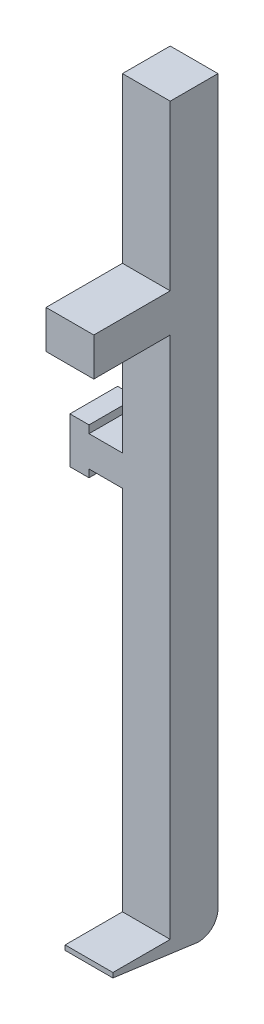
ISO-10303-21;
HEADER;
FILE_DESCRIPTION(('STEP AP214'),'2;1');
FILE_NAME('part.step','',(''),(''),'','','');
FILE_SCHEMA(('AUTOMOTIVE_DESIGN { 1 0 10303 214 1 1 1 1 }'));
ENDSEC;
DATA;
#1=APPLICATION_CONTEXT('core data for automotive mechanical design processes');
#2=APPLICATION_PROTOCOL_DEFINITION('international standard','automotive_design',2000,#1);
#3=PRODUCT_CONTEXT('',#1,'mechanical');
#4=PRODUCT('Part','Part','',(#3));
#5=PRODUCT_RELATED_PRODUCT_CATEGORY('part','',(#4));
#6=PRODUCT_DEFINITION_FORMATION('','',#4);
#7=PRODUCT_DEFINITION_CONTEXT('part definition',#1,'design');
#8=PRODUCT_DEFINITION('design','',#6,#7);
#9=PRODUCT_DEFINITION_SHAPE('','',#8);
#10=(LENGTH_UNIT() NAMED_UNIT(*) SI_UNIT(.MILLI.,.METRE.));
#11=(NAMED_UNIT(*) PLANE_ANGLE_UNIT() SI_UNIT($,.RADIAN.));
#12=(NAMED_UNIT(*) SI_UNIT($,.STERADIAN.) SOLID_ANGLE_UNIT());
#13=UNCERTAINTY_MEASURE_WITH_UNIT(LENGTH_MEASURE(1.E-05),#10,'distance_accuracy_value','');
#14=(GEOMETRIC_REPRESENTATION_CONTEXT(3) GLOBAL_UNCERTAINTY_ASSIGNED_CONTEXT((#13)) GLOBAL_UNIT_ASSIGNED_CONTEXT((#10,
#11,#12)) REPRESENTATION_CONTEXT('',''));
#15=CARTESIAN_POINT('',(0.,0.,0.));
#16=DIRECTION('',(0.,0.,1.));
#17=DIRECTION('',(1.,0.,0.));
#18=AXIS2_PLACEMENT_3D('',#15,#16,#17);
#19=CARTESIAN_POINT('',(-1.25,38.,1.25));
#20=DIRECTION('',(0.,0.,-1.));
#21=DIRECTION('',(-1.,0.,0.));
#22=AXIS2_PLACEMENT_3D('',#19,#20,#21);
#23=PLANE('',#22);
#24=DIRECTION('',(1.,0.,0.));
#25=VECTOR('',#24,1.);
#26=CARTESIAN_POINT('',(-1.25,28.4,1.25));
#27=LINE('',#26,#25);
#28=CARTESIAN_POINT('',(-1.25,28.4,1.25));
#29=VERTEX_POINT('',#28);
#30=CARTESIAN_POINT('',(1.25,28.4,1.25));
#31=VERTEX_POINT('',#30);
#32=EDGE_CURVE('E392',#29,#31,#27,.T.);
#33=ORIENTED_EDGE('',*,*,#32,.F.);
#34=DIRECTION('',(0.,-1.,0.));
#35=VECTOR('',#34,1.);
#36=CARTESIAN_POINT('',(-1.25,38.,1.25));
#37=LINE('',#36,#35);
#38=CARTESIAN_POINT('',(-1.25,21.8,1.25));
#39=VERTEX_POINT('',#38);
#40=EDGE_CURVE('E202',#29,#39,#37,.T.);
#41=ORIENTED_EDGE('',*,*,#40,.T.);
#42=DIRECTION('',(-1.,0.,0.));
#43=VECTOR('',#42,1.);
#44=CARTESIAN_POINT('',(-1.25,21.8,1.25));
#45=LINE('',#44,#43);
#46=CARTESIAN_POINT('',(-3.,21.8,1.25));
#47=VERTEX_POINT('',#46);
#48=EDGE_CURVE('E232',#39,#47,#45,.T.);
#49=ORIENTED_EDGE('',*,*,#48,.T.);
#50=DIRECTION('',(0.,1.,0.));
#51=VECTOR('',#50,1.);
#52=CARTESIAN_POINT('',(-3.,21.8,1.25));
#53=LINE('',#52,#51);
#54=CARTESIAN_POINT('',(-3.,22.2,1.25));
#55=VERTEX_POINT('',#54);
#56=EDGE_CURVE('E226',#47,#55,#53,.T.);
#57=ORIENTED_EDGE('',*,*,#56,.T.);
#58=DIRECTION('',(-1.,0.,0.));
#59=VECTOR('',#58,1.);
#60=CARTESIAN_POINT('',(-3.,22.2,1.25));
#61=LINE('',#60,#59);
#62=CARTESIAN_POINT('',(-4.,22.2,1.25));
#63=VERTEX_POINT('',#62);
#64=EDGE_CURVE('E257',#55,#63,#61,.T.);
#65=ORIENTED_EDGE('',*,*,#64,.T.);
#66=DIRECTION('',(0.,-1.,0.));
#67=VECTOR('',#66,1.);
#68=CARTESIAN_POINT('',(-4.,22.2,1.25));
#69=LINE('',#68,#67);
#70=CARTESIAN_POINT('',(-4.,19.8,1.25));
#71=VERTEX_POINT('',#70);
#72=EDGE_CURVE('E261',#63,#71,#69,.T.);
#73=ORIENTED_EDGE('',*,*,#72,.T.);
#74=DIRECTION('',(-1.,0.,0.));
#75=VECTOR('',#74,1.);
#76=CARTESIAN_POINT('',(-3.,19.8,1.25));
#77=LINE('',#76,#75);
#78=CARTESIAN_POINT('',(-3.,19.8,1.25));
#79=VERTEX_POINT('',#78);
#80=EDGE_CURVE('E265',#79,#71,#77,.T.);
#81=ORIENTED_EDGE('',*,*,#80,.F.);
#82=DIRECTION('',(0.,-1.,0.));
#83=VECTOR('',#82,1.);
#84=CARTESIAN_POINT('',(-3.,20.2,1.25));
#85=LINE('',#84,#83);
#86=CARTESIAN_POINT('',(-3.,20.2,1.25));
#87=VERTEX_POINT('',#86);
#88=EDGE_CURVE('E269',#87,#79,#85,.T.);
#89=ORIENTED_EDGE('',*,*,#88,.F.);
#90=DIRECTION('',(-1.,0.,0.));
#91=VECTOR('',#90,1.);
#92=CARTESIAN_POINT('',(-1.25,20.2,1.25));
#93=LINE('',#92,#91);
#94=CARTESIAN_POINT('',(-1.25,20.2,1.25));
#95=VERTEX_POINT('',#94);
#96=EDGE_CURVE('E272',#95,#87,#93,.T.);
#97=ORIENTED_EDGE('',*,*,#96,.F.);
#98=CARTESIAN_POINT('',(-1.25,1.,1.25));
#99=VERTEX_POINT('',#98);
#100=EDGE_CURVE('E338',#95,#99,#37,.T.);
#101=ORIENTED_EDGE('',*,*,#100,.T.);
#102=DIRECTION('',(-1.,0.,0.));
#103=VECTOR('',#102,1.);
#104=CARTESIAN_POINT('',(-1.25,1.,1.25));
#105=LINE('',#104,#103);
#106=CARTESIAN_POINT('',(1.25,1.,1.25));
#107=VERTEX_POINT('',#106);
#108=EDGE_CURVE('E313',#107,#99,#105,.T.);
#109=ORIENTED_EDGE('',*,*,#108,.F.);
#110=DIRECTION('',(0.,-1.,0.));
#111=VECTOR('',#110,1.);
#112=CARTESIAN_POINT('',(1.25,38.,1.25));
#113=LINE('',#112,#111);
#114=EDGE_CURVE('E61',#31,#107,#113,.T.);
#115=ORIENTED_EDGE('',*,*,#114,.F.);
#116=EDGE_LOOP('',(#33,#41,#49,#57,#65,#73,#81,#89,#97,#101,#109,#115));
#117=FACE_BOUND('',#116,.T.);
#118=ADVANCED_FACE('F45',(#117),#23,.F.);
#119=DIRECTION('',(-1.,0.,0.));
#120=VECTOR('',#119,1.);
#121=CARTESIAN_POINT('',(-1.25,30.4,1.25));
#122=LINE('',#121,#120);
#123=CARTESIAN_POINT('',(1.25,30.4,1.25));
#124=VERTEX_POINT('',#123);
#125=CARTESIAN_POINT('',(-1.25,30.4,1.25));
#126=VERTEX_POINT('',#125);
#127=EDGE_CURVE('E69',#124,#126,#122,.T.);
#128=ORIENTED_EDGE('',*,*,#127,.F.);
#129=CARTESIAN_POINT('',(1.25,39.,1.25));
#130=VERTEX_POINT('',#129);
#131=EDGE_CURVE('E335',#130,#124,#113,.T.);
#132=ORIENTED_EDGE('',*,*,#131,.F.);
#133=DIRECTION('',(1.,0.,0.));
#134=VECTOR('',#133,1.);
#135=CARTESIAN_POINT('',(-1.25,39.,1.25));
#136=LINE('',#135,#134);
#137=CARTESIAN_POINT('',(-1.25,39.,1.25));
#138=VERTEX_POINT('',#137);
#139=EDGE_CURVE('E209',#138,#130,#136,.T.);
#140=ORIENTED_EDGE('',*,*,#139,.F.);
#141=EDGE_CURVE('E339',#138,#126,#37,.T.);
#142=ORIENTED_EDGE('',*,*,#141,.T.);
#143=EDGE_LOOP('',(#128,#132,#140,#142));
#144=FACE_BOUND('',#143,.T.);
#145=ADVANCED_FACE('F380',(#144),#23,.F.);
#146=CARTESIAN_POINT('',(-1.25,38.,1.25));
#147=DIRECTION('',(1.,0.,0.));
#148=DIRECTION('',(0.,0.,-1.));
#149=AXIS2_PLACEMENT_3D('',#146,#147,#148);
#150=PLANE('',#149);
#151=DIRECTION('',(0.,0.,1.));
#152=VECTOR('',#151,1.);
#153=CARTESIAN_POINT('',(-1.25,20.2,-1.25));
#154=LINE('',#153,#152);
#155=CARTESIAN_POINT('',(-1.25,20.2,-1.25));
#156=VERTEX_POINT('',#155);
#157=EDGE_CURVE('E285',#156,#95,#154,.T.);
#158=ORIENTED_EDGE('',*,*,#157,.F.);
#159=DIRECTION('',(0.,-1.,0.));
#160=VECTOR('',#159,1.);
#161=CARTESIAN_POINT('',(-1.25,38.,-1.25));
#162=LINE('',#161,#160);
#163=CARTESIAN_POINT('',(-1.25,1.14561833232611,-1.25));
#164=VERTEX_POINT('',#163);
#165=EDGE_CURVE('E342',#156,#164,#162,.T.);
#166=ORIENTED_EDGE('',*,*,#165,.T.);
#167=CARTESIAN_POINT('',(-1.25,1.14561833232611,-0.25));
#168=DIRECTION('',(1.,0.,0.));
#169=DIRECTION('',(0.,0.,-1.));
#170=AXIS2_PLACEMENT_3D('',#167,#168,#169);
#171=CIRCLE('',#170,1.);
#172=CARTESIAN_POINT('',(-1.25,0.154788164281816,-0.114886795266687));
#173=VERTEX_POINT('',#172);
#174=EDGE_CURVE('E354',#164,#173,#171,.F.);
#175=ORIENTED_EDGE('',*,*,#174,.T.);
#176=DIRECTION('',(0.,0.135113204733313,0.990830168044299));
#177=VECTOR('',#176,1.);
#178=CARTESIAN_POINT('',(-1.25,0.75,4.25));
#179=LINE('',#178,#177);
#180=CARTESIAN_POINT('',(-1.25,0.75,4.25));
#181=VERTEX_POINT('',#180);
#182=EDGE_CURVE('E304',#173,#181,#179,.T.);
#183=ORIENTED_EDGE('',*,*,#182,.T.);
#184=DIRECTION('',(0.,-1.,0.));
#185=VECTOR('',#184,1.);
#186=CARTESIAN_POINT('',(-1.25,0.,4.25));
#187=LINE('',#186,#185);
#188=CARTESIAN_POINT('',(-1.25,1.,4.25));
#189=VERTEX_POINT('',#188);
#190=EDGE_CURVE('E314',#189,#181,#187,.T.);
#191=ORIENTED_EDGE('',*,*,#190,.F.);
#192=DIRECTION('',(0.,0.,-1.));
#193=VECTOR('',#192,1.);
#194=CARTESIAN_POINT('',(-1.25,1.,4.25));
#195=LINE('',#194,#193);
#196=EDGE_CURVE('E324',#189,#99,#195,.T.);
#197=ORIENTED_EDGE('',*,*,#196,.T.);
#198=ORIENTED_EDGE('',*,*,#100,.F.);
#199=EDGE_LOOP('',(#158,#166,#175,#183,#191,#197,#198));
#200=FACE_BOUND('',#199,.T.);
#201=ADVANCED_FACE('F410',(#200),#150,.F.);
#202=CARTESIAN_POINT('',(1.25,38.,1.25));
#203=DIRECTION('',(-1.,0.,0.));
#204=DIRECTION('',(0.,0.,1.));
#205=AXIS2_PLACEMENT_3D('',#202,#203,#204);
#206=PLANE('',#205);
#207=DIRECTION('',(0.,0.135113204733313,0.990830168044299));
#208=VECTOR('',#207,1.);
#209=CARTESIAN_POINT('',(1.25,0.75,4.25));
#210=LINE('',#209,#208);
#211=CARTESIAN_POINT('',(1.25,0.154788164281816,-0.114886795266687));
#212=VERTEX_POINT('',#211);
#213=CARTESIAN_POINT('',(1.25,0.75,4.25));
#214=VERTEX_POINT('',#213);
#215=EDGE_CURVE('E281',#212,#214,#210,.T.);
#216=ORIENTED_EDGE('',*,*,#215,.F.);
#217=CARTESIAN_POINT('',(1.25,1.14561833232611,-0.25));
#218=DIRECTION('',(-1.,0.,0.));
#219=DIRECTION('',(0.,0.,1.));
#220=AXIS2_PLACEMENT_3D('',#217,#218,#219);
#221=CIRCLE('',#220,1.);
#222=CARTESIAN_POINT('',(1.25,1.14561833232611,-1.25));
#223=VERTEX_POINT('',#222);
#224=EDGE_CURVE('E11',#212,#223,#221,.F.);
#225=ORIENTED_EDGE('',*,*,#224,.T.);
#226=DIRECTION('',(0.,-1.,0.));
#227=VECTOR('',#226,1.);
#228=CARTESIAN_POINT('',(1.25,38.,-1.25));
#229=LINE('',#228,#227);
#230=CARTESIAN_POINT('',(1.25,39.,-1.25));
#231=VERTEX_POINT('',#230);
#232=EDGE_CURVE('E346',#231,#223,#229,.T.);
#233=ORIENTED_EDGE('',*,*,#232,.F.);
#234=DIRECTION('',(0.,0.,-1.));
#235=VECTOR('',#234,1.);
#236=CARTESIAN_POINT('',(1.25,39.,-1.25));
#237=LINE('',#236,#235);
#238=EDGE_CURVE('E218',#130,#231,#237,.T.);
#239=ORIENTED_EDGE('',*,*,#238,.F.);
#240=ORIENTED_EDGE('',*,*,#131,.T.);
#241=DIRECTION('',(0.,0.,-1.));
#242=VECTOR('',#241,1.);
#243=CARTESIAN_POINT('',(1.25,30.4,5.25));
#244=LINE('',#243,#242);
#245=CARTESIAN_POINT('',(1.25,30.4,5.25));
#246=VERTEX_POINT('',#245);
#247=EDGE_CURVE('E211',#246,#124,#244,.T.);
#248=ORIENTED_EDGE('',*,*,#247,.F.);
#249=DIRECTION('',(0.,1.,0.));
#250=VECTOR('',#249,1.);
#251=CARTESIAN_POINT('',(1.25,30.4,5.25));
#252=LINE('',#251,#250);
#253=CARTESIAN_POINT('',(1.25,28.4,5.25));
#254=VERTEX_POINT('',#253);
#255=EDGE_CURVE('E187',#254,#246,#252,.T.);
#256=ORIENTED_EDGE('',*,*,#255,.F.);
#257=DIRECTION('',(0.,0.,-1.));
#258=VECTOR('',#257,1.);
#259=CARTESIAN_POINT('',(1.25,28.4,5.25));
#260=LINE('',#259,#258);
#261=EDGE_CURVE('E183',#254,#31,#260,.T.);
#262=ORIENTED_EDGE('',*,*,#261,.T.);
#263=ORIENTED_EDGE('',*,*,#114,.T.);
#264=DIRECTION('',(0.,0.,-1.));
#265=VECTOR('',#264,1.);
#266=CARTESIAN_POINT('',(1.25,1.,4.25));
#267=LINE('',#266,#265);
#268=CARTESIAN_POINT('',(1.25,1.,4.25));
#269=VERTEX_POINT('',#268);
#270=EDGE_CURVE('E331',#269,#107,#267,.T.);
#271=ORIENTED_EDGE('',*,*,#270,.F.);
#272=DIRECTION('',(0.,1.,0.));
#273=VECTOR('',#272,1.);
#274=CARTESIAN_POINT('',(1.25,0.,4.25));
#275=LINE('',#274,#273);
#276=EDGE_CURVE('E318',#214,#269,#275,.T.);
#277=ORIENTED_EDGE('',*,*,#276,.F.);
#278=EDGE_LOOP('',(#216,#225,#233,#239,#240,#248,#256,#262,#263,#271,#277));
#279=FACE_BOUND('',#278,.T.);
#280=ADVANCED_FACE('F368',(#279),#206,.F.);
#281=CARTESIAN_POINT('',(-1.25,38.,-1.25));
#282=DIRECTION('',(0.,0.,1.));
#283=DIRECTION('',(1.,0.,0.));
#284=AXIS2_PLACEMENT_3D('',#281,#282,#283);
#285=PLANE('',#284);
#286=ORIENTED_EDGE('',*,*,#232,.T.);
#287=DIRECTION('',(-1.,0.,0.));
#288=VECTOR('',#287,1.);
#289=CARTESIAN_POINT('',(-1.25,1.14561833232611,-1.25));
#290=LINE('',#289,#288);
#291=EDGE_CURVE('E350',#223,#164,#290,.T.);
#292=ORIENTED_EDGE('',*,*,#291,.T.);
#293=ORIENTED_EDGE('',*,*,#165,.F.);
#294=DIRECTION('',(-1.,0.,0.));
#295=VECTOR('',#294,1.);
#296=CARTESIAN_POINT('',(-1.25,20.2,-1.25));
#297=LINE('',#296,#295);
#298=CARTESIAN_POINT('',(-3.,20.2,-1.25));
#299=VERTEX_POINT('',#298);
#300=EDGE_CURVE('E246',#156,#299,#297,.T.);
#301=ORIENTED_EDGE('',*,*,#300,.T.);
#302=DIRECTION('',(0.,-1.,0.));
#303=VECTOR('',#302,1.);
#304=CARTESIAN_POINT('',(-3.,20.2,-1.25));
#305=LINE('',#304,#303);
#306=CARTESIAN_POINT('',(-3.,19.8,-1.25));
#307=VERTEX_POINT('',#306);
#308=EDGE_CURVE('E243',#299,#307,#305,.T.);
#309=ORIENTED_EDGE('',*,*,#308,.T.);
#310=DIRECTION('',(-1.,0.,0.));
#311=VECTOR('',#310,1.);
#312=CARTESIAN_POINT('',(-3.,19.8,-1.25));
#313=LINE('',#312,#311);
#314=CARTESIAN_POINT('',(-4.,19.8,-1.25));
#315=VERTEX_POINT('',#314);
#316=EDGE_CURVE('E240',#307,#315,#313,.T.);
#317=ORIENTED_EDGE('',*,*,#316,.T.);
#318=DIRECTION('',(0.,-1.,0.));
#319=VECTOR('',#318,1.);
#320=CARTESIAN_POINT('',(-4.,22.2,-1.25));
#321=LINE('',#320,#319);
#322=CARTESIAN_POINT('',(-4.,22.2,-1.25));
#323=VERTEX_POINT('',#322);
#324=EDGE_CURVE('E236',#323,#315,#321,.T.);
#325=ORIENTED_EDGE('',*,*,#324,.F.);
#326=DIRECTION('',(-1.,0.,0.));
#327=VECTOR('',#326,1.);
#328=CARTESIAN_POINT('',(-3.,22.2,-1.25));
#329=LINE('',#328,#327);
#330=CARTESIAN_POINT('',(-3.,22.2,-1.25));
#331=VERTEX_POINT('',#330);
#332=EDGE_CURVE('E231',#331,#323,#329,.T.);
#333=ORIENTED_EDGE('',*,*,#332,.F.);
#334=DIRECTION('',(0.,1.,0.));
#335=VECTOR('',#334,1.);
#336=CARTESIAN_POINT('',(-3.,21.8,-1.25));
#337=LINE('',#336,#335);
#338=CARTESIAN_POINT('',(-3.,21.8,-1.25));
#339=VERTEX_POINT('',#338);
#340=EDGE_CURVE('E227',#339,#331,#337,.T.);
#341=ORIENTED_EDGE('',*,*,#340,.F.);
#342=DIRECTION('',(-1.,0.,0.));
#343=VECTOR('',#342,1.);
#344=CARTESIAN_POINT('',(-1.25,21.8,-1.25));
#345=LINE('',#344,#343);
#346=CARTESIAN_POINT('',(-1.25,21.8,-1.25));
#347=VERTEX_POINT('',#346);
#348=EDGE_CURVE('E249',#347,#339,#345,.T.);
#349=ORIENTED_EDGE('',*,*,#348,.F.);
#350=CARTESIAN_POINT('',(-1.25,39.,-1.25));
#351=VERTEX_POINT('',#350);
#352=EDGE_CURVE('E343',#351,#347,#162,.T.);
#353=ORIENTED_EDGE('',*,*,#352,.F.);
#354=DIRECTION('',(-1.,0.,0.));
#355=VECTOR('',#354,1.);
#356=CARTESIAN_POINT('',(-1.25,39.,-1.25));
#357=LINE('',#356,#355);
#358=EDGE_CURVE('E222',#231,#351,#357,.T.);
#359=ORIENTED_EDGE('',*,*,#358,.F.);
#360=EDGE_LOOP('',(#286,#292,#293,#301,#309,#317,#325,#333,#341,#349,#353,#359));
#361=FACE_BOUND('',#360,.T.);
#362=ADVANCED_FACE('F373',(#361),#285,.F.);
#363=ORIENTED_EDGE('',*,*,#352,.T.);
#364=DIRECTION('',(0.,0.,1.));
#365=VECTOR('',#364,1.);
#366=CARTESIAN_POINT('',(-1.25,21.8,-1.25));
#367=LINE('',#366,#365);
#368=EDGE_CURVE('E282',#347,#39,#367,.T.);
#369=ORIENTED_EDGE('',*,*,#368,.T.);
#370=ORIENTED_EDGE('',*,*,#40,.F.);
#371=DIRECTION('',(0.,0.,-1.));
#372=VECTOR('',#371,1.);
#373=CARTESIAN_POINT('',(-1.25,28.4,5.25));
#374=LINE('',#373,#372);
#375=CARTESIAN_POINT('',(-1.25,28.4,5.25));
#376=VERTEX_POINT('',#375);
#377=EDGE_CURVE('E181',#376,#29,#374,.T.);
#378=ORIENTED_EDGE('',*,*,#377,.F.);
#379=DIRECTION('',(0.,-1.,0.));
#380=VECTOR('',#379,1.);
#381=CARTESIAN_POINT('',(-1.25,30.4,5.25));
#382=LINE('',#381,#380);
#383=CARTESIAN_POINT('',(-1.25,30.4,5.25));
#384=VERTEX_POINT('',#383);
#385=EDGE_CURVE('E188',#384,#376,#382,.T.);
#386=ORIENTED_EDGE('',*,*,#385,.F.);
#387=DIRECTION('',(0.,0.,-1.));
#388=VECTOR('',#387,1.);
#389=CARTESIAN_POINT('',(-1.25,30.4,5.25));
#390=LINE('',#389,#388);
#391=EDGE_CURVE('E386',#384,#126,#390,.T.);
#392=ORIENTED_EDGE('',*,*,#391,.T.);
#393=ORIENTED_EDGE('',*,*,#141,.F.);
#394=DIRECTION('',(0.,0.,1.));
#395=VECTOR('',#394,1.);
#396=CARTESIAN_POINT('',(-1.25,39.,-1.25));
#397=LINE('',#396,#395);
#398=EDGE_CURVE('E204',#351,#138,#397,.T.);
#399=ORIENTED_EDGE('',*,*,#398,.F.);
#400=EDGE_LOOP('',(#363,#369,#370,#378,#386,#392,#393,#399));
#401=FACE_BOUND('',#400,.T.);
#402=ADVANCED_FACE('F200',(#401),#150,.F.);
#403=CARTESIAN_POINT('',(-1.25,1.,4.25));
#404=DIRECTION('',(0.,-1.,0.));
#405=DIRECTION('',(0.,0.,-1.));
#406=AXIS2_PLACEMENT_3D('',#403,#404,#405);
#407=PLANE('',#406);
#408=ORIENTED_EDGE('',*,*,#108,.T.);
#409=ORIENTED_EDGE('',*,*,#196,.F.);
#410=DIRECTION('',(-1.,0.,0.));
#411=VECTOR('',#410,1.);
#412=CARTESIAN_POINT('',(-1.25,1.,4.25));
#413=LINE('',#412,#411);
#414=EDGE_CURVE('E321',#269,#189,#413,.T.);
#415=ORIENTED_EDGE('',*,*,#414,.F.);
#416=ORIENTED_EDGE('',*,*,#270,.T.);
#417=EDGE_LOOP('',(#408,#409,#415,#416));
#418=FACE_BOUND('',#417,.T.);
#419=ADVANCED_FACE('F404',(#418),#407,.F.);
#420=CARTESIAN_POINT('',(0.,0.,4.25));
#421=DIRECTION('',(0.,0.,-1.));
#422=DIRECTION('',(-1.,0.,0.));
#423=AXIS2_PLACEMENT_3D('',#420,#421,#422);
#424=PLANE('',#423);
#425=ORIENTED_EDGE('',*,*,#190,.T.);
#426=DIRECTION('',(1.,0.,0.));
#427=VECTOR('',#426,1.);
#428=CARTESIAN_POINT('',(-1.25,0.75,4.25));
#429=LINE('',#428,#427);
#430=EDGE_CURVE('E307',#181,#214,#429,.T.);
#431=ORIENTED_EDGE('',*,*,#430,.T.);
#432=ORIENTED_EDGE('',*,*,#276,.T.);
#433=ORIENTED_EDGE('',*,*,#414,.T.);
#434=EDGE_LOOP('',(#425,#431,#432,#433));
#435=FACE_BOUND('',#434,.T.);
#436=ADVANCED_FACE('F407',(#435),#424,.F.);
#437=CARTESIAN_POINT('',(-1.25,0.75,4.25));
#438=DIRECTION('',(0.,0.990830168044299,-0.135113204733313));
#439=DIRECTION('',(0.,0.135113204733313,0.990830168044299));
#440=AXIS2_PLACEMENT_3D('',#437,#438,#439);
#441=PLANE('',#440);
#442=ORIENTED_EDGE('',*,*,#182,.F.);
#443=DIRECTION('',(-1.,0.,0.));
#444=VECTOR('',#443,1.);
#445=CARTESIAN_POINT('',(-1.25,0.154788164281816,-0.114886795266687));
#446=LINE('',#445,#444);
#447=EDGE_CURVE('E54',#173,#212,#446,.F.);
#448=ORIENTED_EDGE('',*,*,#447,.T.);
#449=ORIENTED_EDGE('',*,*,#215,.T.);
#450=ORIENTED_EDGE('',*,*,#430,.F.);
#451=EDGE_LOOP('',(#442,#448,#449,#450));
#452=FACE_BOUND('',#451,.T.);
#453=ADVANCED_FACE('F361',(#452),#441,.F.);
#454=CARTESIAN_POINT('',(-1.25,1.14561833232611,-0.25));
#455=DIRECTION('',(-1.,0.,0.));
#456=DIRECTION('',(0.,0.,1.));
#457=AXIS2_PLACEMENT_3D('',#454,#455,#456);
#458=CYLINDRICAL_SURFACE('',#457,1.);
#459=ORIENTED_EDGE('',*,*,#224,.F.);
#460=ORIENTED_EDGE('',*,*,#447,.F.);
#461=ORIENTED_EDGE('',*,*,#174,.F.);
#462=ORIENTED_EDGE('',*,*,#291,.F.);
#463=EDGE_LOOP('',(#459,#460,#461,#462));
#464=FACE_BOUND('',#463,.T.);
#465=ADVANCED_FACE('F47',(#464),#458,.T.);
#466=CARTESIAN_POINT('',(-3.,21.8,-1.25));
#467=DIRECTION('',(1.,0.,0.));
#468=DIRECTION('',(0.,0.,-1.));
#469=AXIS2_PLACEMENT_3D('',#466,#467,#468);
#470=PLANE('',#469);
#471=ORIENTED_EDGE('',*,*,#56,.F.);
#472=DIRECTION('',(0.,0.,1.));
#473=VECTOR('',#472,1.);
#474=CARTESIAN_POINT('',(-3.,21.8,-1.25));
#475=LINE('',#474,#473);
#476=EDGE_CURVE('E278',#339,#47,#475,.T.);
#477=ORIENTED_EDGE('',*,*,#476,.F.);
#478=ORIENTED_EDGE('',*,*,#340,.T.);
#479=DIRECTION('',(0.,0.,1.));
#480=VECTOR('',#479,1.);
#481=CARTESIAN_POINT('',(-3.,22.2,-1.25));
#482=LINE('',#481,#480);
#483=EDGE_CURVE('E253',#331,#55,#482,.T.);
#484=ORIENTED_EDGE('',*,*,#483,.T.);
#485=EDGE_LOOP('',(#471,#477,#478,#484));
#486=FACE_BOUND('',#485,.T.);
#487=ADVANCED_FACE('F423',(#486),#470,.T.);
#488=CARTESIAN_POINT('',(-1.25,21.8,-1.25));
#489=DIRECTION('',(0.,1.,0.));
#490=DIRECTION('',(0.,0.,1.));
#491=AXIS2_PLACEMENT_3D('',#488,#489,#490);
#492=PLANE('',#491);
#493=ORIENTED_EDGE('',*,*,#48,.F.);
#494=ORIENTED_EDGE('',*,*,#368,.F.);
#495=ORIENTED_EDGE('',*,*,#348,.T.);
#496=ORIENTED_EDGE('',*,*,#476,.T.);
#497=EDGE_LOOP('',(#493,#494,#495,#496));
#498=FACE_BOUND('',#497,.T.);
#499=ADVANCED_FACE('F416',(#498),#492,.T.);
#500=CARTESIAN_POINT('',(-1.25,20.2,-1.25));
#501=DIRECTION('',(0.,1.,0.));
#502=DIRECTION('',(0.,0.,1.));
#503=AXIS2_PLACEMENT_3D('',#500,#501,#502);
#504=PLANE('',#503);
#505=ORIENTED_EDGE('',*,*,#96,.T.);
#506=DIRECTION('',(0.,0.,1.));
#507=VECTOR('',#506,1.);
#508=CARTESIAN_POINT('',(-3.,20.2,-1.25));
#509=LINE('',#508,#507);
#510=EDGE_CURVE('E288',#299,#87,#509,.T.);
#511=ORIENTED_EDGE('',*,*,#510,.F.);
#512=ORIENTED_EDGE('',*,*,#300,.F.);
#513=ORIENTED_EDGE('',*,*,#157,.T.);
#514=EDGE_LOOP('',(#505,#511,#512,#513));
#515=FACE_BOUND('',#514,.T.);
#516=ADVANCED_FACE('F442',(#515),#504,.F.);
#517=CARTESIAN_POINT('',(-3.,20.2,-1.25));
#518=DIRECTION('',(-1.,0.,0.));
#519=DIRECTION('',(0.,0.,1.));
#520=AXIS2_PLACEMENT_3D('',#517,#518,#519);
#521=PLANE('',#520);
#522=ORIENTED_EDGE('',*,*,#88,.T.);
#523=DIRECTION('',(0.,0.,1.));
#524=VECTOR('',#523,1.);
#525=CARTESIAN_POINT('',(-3.,19.8,-1.25));
#526=LINE('',#525,#524);
#527=EDGE_CURVE('E292',#307,#79,#526,.T.);
#528=ORIENTED_EDGE('',*,*,#527,.F.);
#529=ORIENTED_EDGE('',*,*,#308,.F.);
#530=ORIENTED_EDGE('',*,*,#510,.T.);
#531=EDGE_LOOP('',(#522,#528,#529,#530));
#532=FACE_BOUND('',#531,.T.);
#533=ADVANCED_FACE('F438',(#532),#521,.F.);
#534=CARTESIAN_POINT('',(-3.,19.8,-1.25));
#535=DIRECTION('',(0.,1.,0.));
#536=DIRECTION('',(0.,0.,1.));
#537=AXIS2_PLACEMENT_3D('',#534,#535,#536);
#538=PLANE('',#537);
#539=ORIENTED_EDGE('',*,*,#80,.T.);
#540=DIRECTION('',(0.,0.,1.));
#541=VECTOR('',#540,1.);
#542=CARTESIAN_POINT('',(-4.,19.8,-1.25));
#543=LINE('',#542,#541);
#544=EDGE_CURVE('E296',#315,#71,#543,.T.);
#545=ORIENTED_EDGE('',*,*,#544,.F.);
#546=ORIENTED_EDGE('',*,*,#316,.F.);
#547=ORIENTED_EDGE('',*,*,#527,.T.);
#548=EDGE_LOOP('',(#539,#545,#546,#547));
#549=FACE_BOUND('',#548,.T.);
#550=ADVANCED_FACE('F434',(#549),#538,.F.);
#551=CARTESIAN_POINT('',(-4.,22.2,-1.25));
#552=DIRECTION('',(-1.,0.,0.));
#553=DIRECTION('',(0.,-1.,0.));
#554=AXIS2_PLACEMENT_3D('',#551,#552,#553);
#555=PLANE('',#554);
#556=ORIENTED_EDGE('',*,*,#72,.F.);
#557=DIRECTION('',(0.,0.,1.));
#558=VECTOR('',#557,1.);
#559=CARTESIAN_POINT('',(-4.,22.2,-1.25));
#560=LINE('',#559,#558);
#561=EDGE_CURVE('E299',#323,#63,#560,.T.);
#562=ORIENTED_EDGE('',*,*,#561,.F.);
#563=ORIENTED_EDGE('',*,*,#324,.T.);
#564=ORIENTED_EDGE('',*,*,#544,.T.);
#565=EDGE_LOOP('',(#556,#562,#563,#564));
#566=FACE_BOUND('',#565,.T.);
#567=ADVANCED_FACE('F430',(#566),#555,.T.);
#568=CARTESIAN_POINT('',(-3.,22.2,-1.25));
#569=DIRECTION('',(0.,1.,0.));
#570=DIRECTION('',(0.,0.,1.));
#571=AXIS2_PLACEMENT_3D('',#568,#569,#570);
#572=PLANE('',#571);
#573=ORIENTED_EDGE('',*,*,#64,.F.);
#574=ORIENTED_EDGE('',*,*,#483,.F.);
#575=ORIENTED_EDGE('',*,*,#332,.T.);
#576=ORIENTED_EDGE('',*,*,#561,.T.);
#577=EDGE_LOOP('',(#573,#574,#575,#576));
#578=FACE_BOUND('',#577,.T.);
#579=ADVANCED_FACE('F428',(#578),#572,.T.);
#580=CARTESIAN_POINT('',(0.,39.,0.));
#581=DIRECTION('',(0.,1.,0.));
#582=DIRECTION('',(0.,0.,1.));
#583=AXIS2_PLACEMENT_3D('',#580,#581,#582);
#584=PLANE('',#583);
#585=ORIENTED_EDGE('',*,*,#398,.T.);
#586=ORIENTED_EDGE('',*,*,#139,.T.);
#587=ORIENTED_EDGE('',*,*,#238,.T.);
#588=ORIENTED_EDGE('',*,*,#358,.T.);
#589=EDGE_LOOP('',(#585,#586,#587,#588));
#590=FACE_BOUND('',#589,.T.);
#591=ADVANCED_FACE('F377',(#590),#584,.T.);
#592=CARTESIAN_POINT('',(-1.25,28.4,5.25));
#593=DIRECTION('',(0.,1.,0.));
#594=DIRECTION('',(0.,0.,1.));
#595=AXIS2_PLACEMENT_3D('',#592,#593,#594);
#596=PLANE('',#595);
#597=ORIENTED_EDGE('',*,*,#32,.T.);
#598=ORIENTED_EDGE('',*,*,#261,.F.);
#599=DIRECTION('',(1.,0.,0.));
#600=VECTOR('',#599,1.);
#601=CARTESIAN_POINT('',(-1.25,28.4,5.25));
#602=LINE('',#601,#600);
#603=EDGE_CURVE('E177',#376,#254,#602,.T.);
#604=ORIENTED_EDGE('',*,*,#603,.F.);
#605=ORIENTED_EDGE('',*,*,#377,.T.);
#606=EDGE_LOOP('',(#597,#598,#604,#605));
#607=FACE_BOUND('',#606,.T.);
#608=ADVANCED_FACE('F179',(#607),#596,.F.);
#609=CARTESIAN_POINT('',(-1.25,30.4,5.25));
#610=DIRECTION('',(0.,-1.,0.));
#611=DIRECTION('',(0.,0.,-1.));
#612=AXIS2_PLACEMENT_3D('',#609,#610,#611);
#613=PLANE('',#612);
#614=ORIENTED_EDGE('',*,*,#127,.T.);
#615=ORIENTED_EDGE('',*,*,#391,.F.);
#616=DIRECTION('',(-1.,0.,0.));
#617=VECTOR('',#616,1.);
#618=CARTESIAN_POINT('',(-1.25,30.4,5.25));
#619=LINE('',#618,#617);
#620=EDGE_CURVE('E193',#246,#384,#619,.T.);
#621=ORIENTED_EDGE('',*,*,#620,.F.);
#622=ORIENTED_EDGE('',*,*,#247,.T.);
#623=EDGE_LOOP('',(#614,#615,#621,#622));
#624=FACE_BOUND('',#623,.T.);
#625=ADVANCED_FACE('F384',(#624),#613,.F.);
#626=CARTESIAN_POINT('',(0.,0.,5.25));
#627=DIRECTION('',(0.,0.,1.));
#628=DIRECTION('',(1.,0.,0.));
#629=AXIS2_PLACEMENT_3D('',#626,#627,#628);
#630=PLANE('',#629);
#631=ORIENTED_EDGE('',*,*,#385,.T.);
#632=ORIENTED_EDGE('',*,*,#603,.T.);
#633=ORIENTED_EDGE('',*,*,#255,.T.);
#634=ORIENTED_EDGE('',*,*,#620,.T.);
#635=EDGE_LOOP('',(#631,#632,#633,#634));
#636=FACE_BOUND('',#635,.T.);
#637=ADVANCED_FACE('F191',(#636),#630,.T.);
#638=CLOSED_SHELL('',(#118,#145,#201,#280,#362,#402,#419,#436,#453,#465,#487,#499,#516,#533,
#550,#567,#579,#591,#608,#625,#637));
#639=MANIFOLD_SOLID_BREP('B2',#638);
#640=ADVANCED_BREP_SHAPE_REPRESENTATION('',(#18,#639),#14);
#641=SHAPE_DEFINITION_REPRESENTATION(#9,#640);
ENDSEC;
END-ISO-10303-21;
